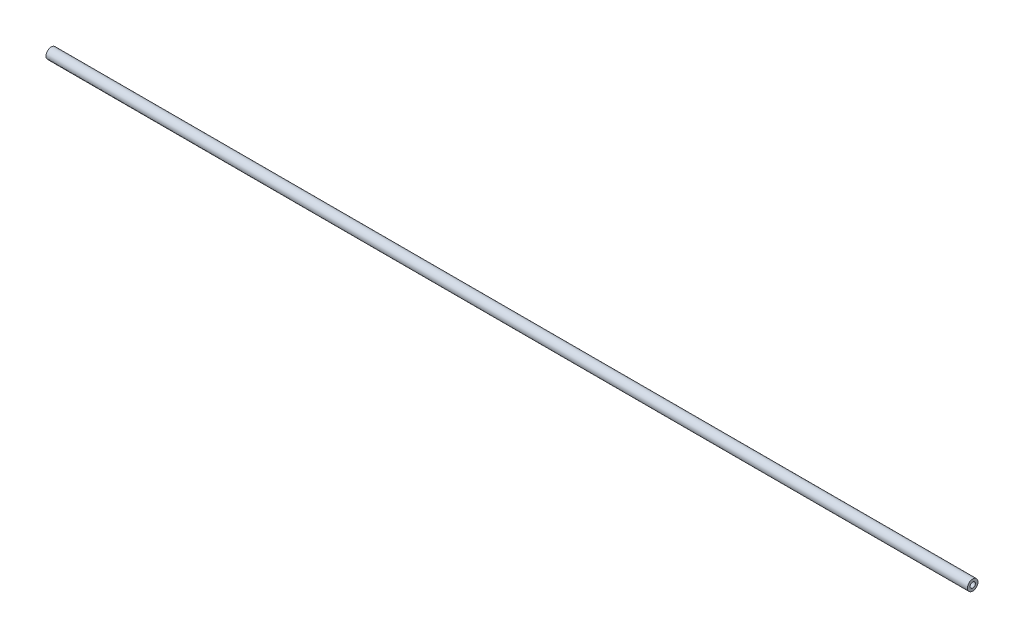
ISO-10303-21;
HEADER;
FILE_DESCRIPTION(('STEP AP214'),'2;1');
FILE_NAME('part.step','',(''),(''),'','','');
FILE_SCHEMA(('AUTOMOTIVE_DESIGN { 1 0 10303 214 1 1 1 1 }'));
ENDSEC;
DATA;
#1=APPLICATION_CONTEXT('core data for automotive mechanical design processes');
#2=APPLICATION_PROTOCOL_DEFINITION('international standard','automotive_design',2000,#1);
#3=PRODUCT_CONTEXT('',#1,'mechanical');
#4=PRODUCT('Part','Part','',(#3));
#5=PRODUCT_RELATED_PRODUCT_CATEGORY('part','',(#4));
#6=PRODUCT_DEFINITION_FORMATION('','',#4);
#7=PRODUCT_DEFINITION_CONTEXT('part definition',#1,'design');
#8=PRODUCT_DEFINITION('design','',#6,#7);
#9=PRODUCT_DEFINITION_SHAPE('','',#8);
#10=(LENGTH_UNIT() NAMED_UNIT(*) SI_UNIT(.MILLI.,.METRE.));
#11=(NAMED_UNIT(*) PLANE_ANGLE_UNIT() SI_UNIT($,.RADIAN.));
#12=(NAMED_UNIT(*) SI_UNIT($,.STERADIAN.) SOLID_ANGLE_UNIT());
#13=UNCERTAINTY_MEASURE_WITH_UNIT(LENGTH_MEASURE(1.E-05),#10,'distance_accuracy_value','');
#14=(GEOMETRIC_REPRESENTATION_CONTEXT(3) GLOBAL_UNCERTAINTY_ASSIGNED_CONTEXT((#13)) GLOBAL_UNIT_ASSIGNED_CONTEXT((#10,
#11,#12)) REPRESENTATION_CONTEXT('',''));
#15=CARTESIAN_POINT('',(0.,0.,0.));
#16=DIRECTION('',(0.,0.,1.));
#17=DIRECTION('',(1.,0.,0.));
#18=AXIS2_PLACEMENT_3D('',#15,#16,#17);
#19=CARTESIAN_POINT('',(355.656854249492,-9.83934404559585,18.4423658907042));
#20=DIRECTION('',(-1.,0.,0.));
#21=DIRECTION('',(0.,0.,1.));
#22=AXIS2_PLACEMENT_3D('',#19,#20,#21);
#23=CYLINDRICAL_SURFACE('',#22,1.);
#24=CARTESIAN_POINT('',(0.,-9.83934404559585,18.4423658907042));
#25=DIRECTION('',(1.,0.,0.));
#26=DIRECTION('',(0.,0.,-1.));
#27=AXIS2_PLACEMENT_3D('',#24,#25,#26);
#28=CIRCLE('',#27,1.);
#29=CARTESIAN_POINT('',(0.,-9.83934404559585,17.4423658907042));
#30=VERTEX_POINT('',#29);
#31=EDGE_CURVE('E48',#30,#30,#28,.T.);
#32=ORIENTED_EDGE('',*,*,#31,.F.);
#33=EDGE_LOOP('',(#32));
#34=FACE_BOUND('',#33,.T.);
#35=CARTESIAN_POINT('',(350.,-9.83934404559585,18.4423658907042));
#36=DIRECTION('',(1.,0.,0.));
#37=DIRECTION('',(0.,0.,-1.));
#38=AXIS2_PLACEMENT_3D('',#35,#36,#37);
#39=CIRCLE('',#38,1.);
#40=CARTESIAN_POINT('',(350.,-9.83934404559585,17.4423658907042));
#41=VERTEX_POINT('',#40);
#42=EDGE_CURVE('E57',#41,#41,#39,.T.);
#43=ORIENTED_EDGE('',*,*,#42,.T.);
#44=EDGE_LOOP('',(#43));
#45=FACE_BOUND('',#44,.T.);
#46=ADVANCED_FACE('F41',(#34,#45),#23,.F.);
#47=CARTESIAN_POINT('',(355.656854249492,-9.83934404559585,18.4423658907042));
#48=DIRECTION('',(-1.,0.,0.));
#49=DIRECTION('',(0.,0.,1.));
#50=AXIS2_PLACEMENT_3D('',#47,#48,#49);
#51=CYLINDRICAL_SURFACE('',#50,2.);
#52=CARTESIAN_POINT('',(0.,-9.83934404559585,18.4423658907042));
#53=DIRECTION('',(1.,0.,0.));
#54=DIRECTION('',(0.,0.,-1.));
#55=AXIS2_PLACEMENT_3D('',#52,#53,#54);
#56=CIRCLE('',#55,2.);
#57=CARTESIAN_POINT('',(0.,-9.83934404559585,16.4423658907042));
#58=VERTEX_POINT('',#57);
#59=EDGE_CURVE('E52',#58,#58,#56,.T.);
#60=ORIENTED_EDGE('',*,*,#59,.T.);
#61=EDGE_LOOP('',(#60));
#62=FACE_BOUND('',#61,.T.);
#63=CARTESIAN_POINT('',(350.,-9.83934404559585,18.4423658907042));
#64=DIRECTION('',(1.,0.,0.));
#65=DIRECTION('',(0.,0.,-1.));
#66=AXIS2_PLACEMENT_3D('',#63,#64,#65);
#67=CIRCLE('',#66,2.);
#68=CARTESIAN_POINT('',(350.,-9.83934404559585,16.4423658907042));
#69=VERTEX_POINT('',#68);
#70=EDGE_CURVE('E10',#69,#69,#67,.T.);
#71=ORIENTED_EDGE('',*,*,#70,.F.);
#72=EDGE_LOOP('',(#71));
#73=FACE_BOUND('',#72,.T.);
#74=ADVANCED_FACE('F69',(#62,#73),#51,.T.);
#75=CARTESIAN_POINT('',(0.,0.,0.));
#76=DIRECTION('',(1.,0.,0.));
#77=DIRECTION('',(0.,0.,-1.));
#78=AXIS2_PLACEMENT_3D('',#75,#76,#77);
#79=PLANE('',#78);
#80=ORIENTED_EDGE('',*,*,#31,.T.);
#81=EDGE_LOOP('',(#80));
#82=FACE_BOUND('',#81,.T.);
#83=ORIENTED_EDGE('',*,*,#59,.F.);
#84=EDGE_LOOP('',(#83));
#85=FACE_BOUND('',#84,.T.);
#86=ADVANCED_FACE('F64',(#82,#85),#79,.F.);
#87=CARTESIAN_POINT('',(350.,0.,0.));
#88=DIRECTION('',(1.,0.,0.));
#89=DIRECTION('',(0.,0.,-1.));
#90=AXIS2_PLACEMENT_3D('',#87,#88,#89);
#91=PLANE('',#90);
#92=ORIENTED_EDGE('',*,*,#42,.F.);
#93=EDGE_LOOP('',(#92));
#94=FACE_BOUND('',#93,.T.);
#95=ORIENTED_EDGE('',*,*,#70,.T.);
#96=EDGE_LOOP('',(#95));
#97=FACE_BOUND('',#96,.T.);
#98=ADVANCED_FACE('F43',(#94,#97),#91,.T.);
#99=CLOSED_SHELL('',(#46,#74,#86,#98));
#100=MANIFOLD_SOLID_BREP('B2',#99);
#101=ADVANCED_BREP_SHAPE_REPRESENTATION('',(#18,#100),#14);
#102=SHAPE_DEFINITION_REPRESENTATION(#9,#101);
ENDSEC;
END-ISO-10303-21;
